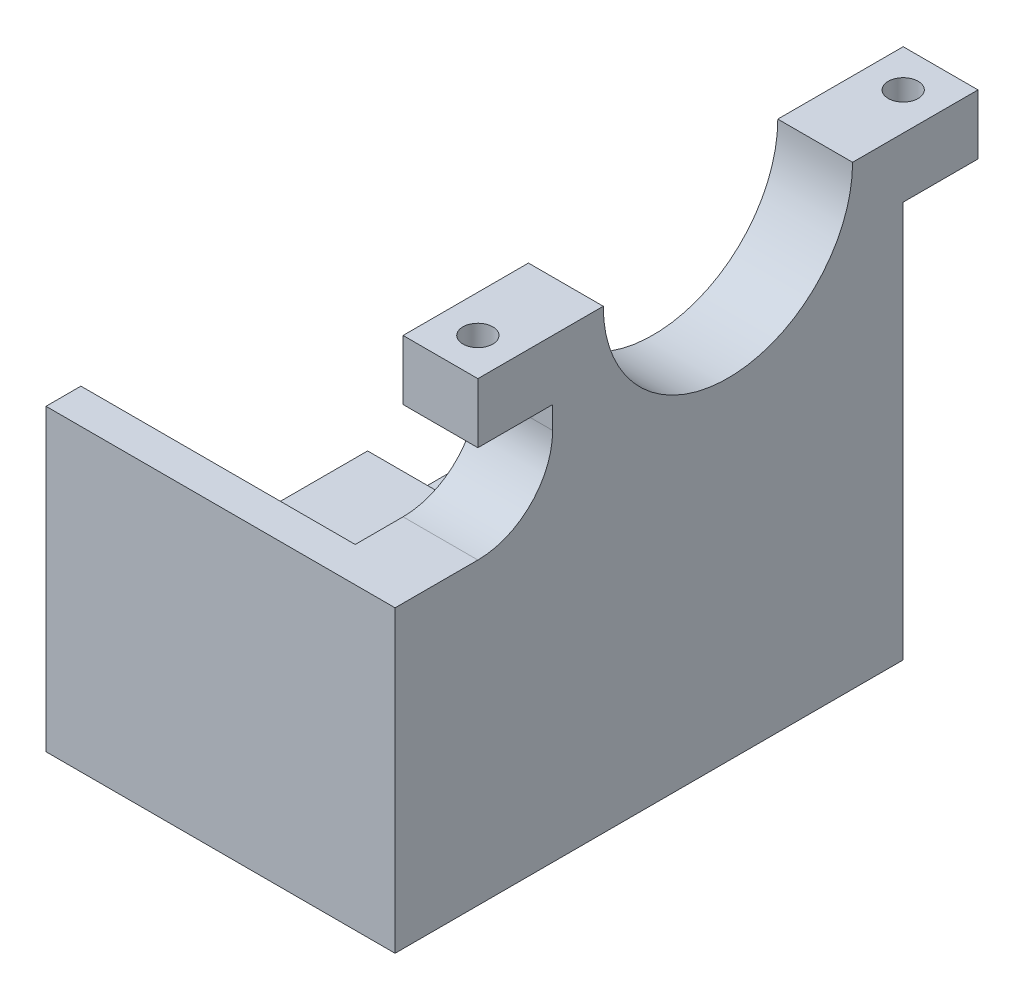
ISO-10303-21;
HEADER;
FILE_DESCRIPTION(('STEP AP214'),'2;1');
FILE_NAME('part.step','',(''),(''),'','','');
FILE_SCHEMA(('AUTOMOTIVE_DESIGN { 1 0 10303 214 1 1 1 1 }'));
ENDSEC;
DATA;
#1=APPLICATION_CONTEXT('core data for automotive mechanical design processes');
#2=APPLICATION_PROTOCOL_DEFINITION('international standard','automotive_design',2000,#1);
#3=PRODUCT_CONTEXT('',#1,'mechanical');
#4=PRODUCT('Part','Part','',(#3));
#5=PRODUCT_RELATED_PRODUCT_CATEGORY('part','',(#4));
#6=PRODUCT_DEFINITION_FORMATION('','',#4);
#7=PRODUCT_DEFINITION_CONTEXT('part definition',#1,'design');
#8=PRODUCT_DEFINITION('design','',#6,#7);
#9=PRODUCT_DEFINITION_SHAPE('','',#8);
#10=(LENGTH_UNIT() NAMED_UNIT(*) SI_UNIT(.MILLI.,.METRE.));
#11=(NAMED_UNIT(*) PLANE_ANGLE_UNIT() SI_UNIT($,.RADIAN.));
#12=(NAMED_UNIT(*) SI_UNIT($,.STERADIAN.) SOLID_ANGLE_UNIT());
#13=UNCERTAINTY_MEASURE_WITH_UNIT(LENGTH_MEASURE(1.E-05),#10,'distance_accuracy_value','');
#14=(GEOMETRIC_REPRESENTATION_CONTEXT(3) GLOBAL_UNCERTAINTY_ASSIGNED_CONTEXT((#13)) GLOBAL_UNIT_ASSIGNED_CONTEXT((#10,
#11,#12)) REPRESENTATION_CONTEXT('',''));
#15=CARTESIAN_POINT('',(0.,0.,0.));
#16=DIRECTION('',(0.,0.,1.));
#17=DIRECTION('',(1.,0.,0.));
#18=AXIS2_PLACEMENT_3D('',#15,#16,#17);
#19=CARTESIAN_POINT('',(-92.925,29.,0.));
#20=DIRECTION('',(0.,-1.,0.));
#21=DIRECTION('',(0.,0.,1.));
#22=AXIS2_PLACEMENT_3D('',#19,#20,#21);
#23=PLANE('',#22);
#24=DIRECTION('',(1.,0.,0.));
#25=VECTOR('',#24,1.);
#26=CARTESIAN_POINT('',(-92.925,29.,-80.1975398981366));
#27=LINE('',#26,#25);
#28=CARTESIAN_POINT('',(-92.925,29.,-80.1975398981366));
#29=VERTEX_POINT('',#28);
#30=CARTESIAN_POINT('',(-84.225,29.,-80.1975398981366));
#31=VERTEX_POINT('',#30);
#32=EDGE_CURVE('E324',#29,#31,#27,.T.);
#33=ORIENTED_EDGE('',*,*,#32,.F.);
#34=DIRECTION('',(0.,0.,1.));
#35=VECTOR('',#34,1.);
#36=CARTESIAN_POINT('',(-92.925,29.,0.));
#37=LINE('',#36,#35);
#38=CARTESIAN_POINT('',(-92.925,29.,-71.4975398981366));
#39=VERTEX_POINT('',#38);
#40=EDGE_CURVE('E319',#29,#39,#37,.T.);
#41=ORIENTED_EDGE('',*,*,#40,.T.);
#42=DIRECTION('',(1.,0.,0.));
#43=VECTOR('',#42,1.);
#44=CARTESIAN_POINT('',(0.,29.,-71.4975398981366));
#45=LINE('',#44,#43);
#46=CARTESIAN_POINT('',(-84.225,29.,-71.4975398981366));
#47=VERTEX_POINT('',#46);
#48=EDGE_CURVE('E464',#39,#47,#45,.T.);
#49=ORIENTED_EDGE('',*,*,#48,.T.);
#50=DIRECTION('',(0.,0.,-1.));
#51=VECTOR('',#50,1.);
#52=CARTESIAN_POINT('',(-84.225,29.,0.));
#53=LINE('',#52,#51);
#54=EDGE_CURVE('E447',#47,#31,#53,.T.);
#55=ORIENTED_EDGE('',*,*,#54,.T.);
#56=EDGE_LOOP('',(#33,#41,#49,#55));
#57=FACE_BOUND('',#56,.T.);
#58=ADVANCED_FACE('F37',(#57),#23,.F.);
#59=CARTESIAN_POINT('',(-65.425,-35.9364248901641,-80.1975398981366));
#60=DIRECTION('',(0.,0.,-1.));
#61=DIRECTION('',(1.,0.,0.));
#62=AXIS2_PLACEMENT_3D('',#59,#60,#61);
#63=PLANE('',#62);
#64=DIRECTION('',(0.,1.,0.));
#65=VECTOR('',#64,1.);
#66=CARTESIAN_POINT('',(-74.225,23.,-80.1975398981366));
#67=LINE('',#66,#65);
#68=CARTESIAN_POINT('',(-74.225,23.,-80.1975398981366));
#69=VERTEX_POINT('',#68);
#70=CARTESIAN_POINT('',(-74.225,29.,-80.1975398981366));
#71=VERTEX_POINT('',#70);
#72=EDGE_CURVE('E454',#69,#71,#67,.T.);
#73=ORIENTED_EDGE('',*,*,#72,.T.);
#74=CARTESIAN_POINT('',(-65.525,29.,-80.1975398981366));
#75=VERTEX_POINT('',#74);
#76=EDGE_CURVE('E328',#71,#75,#27,.T.);
#77=ORIENTED_EDGE('',*,*,#76,.T.);
#78=CARTESIAN_POINT('',(-65.525,29.1,-80.1975398981366));
#79=DIRECTION('',(0.,0.,1.));
#80=DIRECTION('',(1.,0.,0.));
#81=AXIS2_PLACEMENT_3D('',#78,#79,#80);
#82=CIRCLE('',#81,0.1);
#83=CARTESIAN_POINT('',(-65.425,29.1,-80.1975398981366));
#84=VERTEX_POINT('',#83);
#85=EDGE_CURVE('E359',#75,#84,#82,.T.);
#86=ORIENTED_EDGE('',*,*,#85,.T.);
#87=DIRECTION('',(0.,1.,0.));
#88=VECTOR('',#87,1.);
#89=CARTESIAN_POINT('',(-65.425,-35.9364248901641,-80.1975398981366));
#90=LINE('',#89,#88);
#91=CARTESIAN_POINT('',(-65.425,58.75,-80.1975398981366));
#92=VERTEX_POINT('',#91);
#93=EDGE_CURVE('E341',#84,#92,#90,.T.);
#94=ORIENTED_EDGE('',*,*,#93,.T.);
#95=DIRECTION('',(-1.,0.,0.));
#96=VECTOR('',#95,1.);
#97=CARTESIAN_POINT('',(0.,58.75,-80.1975398981366));
#98=LINE('',#97,#96);
#99=CARTESIAN_POINT('',(-57.925,58.75,-80.1975398981366));
#100=VERTEX_POINT('',#99);
#101=EDGE_CURVE('E238',#100,#92,#98,.T.);
#102=ORIENTED_EDGE('',*,*,#101,.F.);
#103=DIRECTION('',(0.,1.,0.));
#104=VECTOR('',#103,1.);
#105=CARTESIAN_POINT('',(-57.925,-35.9364248901641,-80.1975398981366));
#106=LINE('',#105,#104);
#107=CARTESIAN_POINT('',(-57.925,19.,-80.1975398981366));
#108=VERTEX_POINT('',#107);
#109=EDGE_CURVE('E337',#108,#100,#106,.T.);
#110=ORIENTED_EDGE('',*,*,#109,.F.);
#111=DIRECTION('',(1.,0.,0.));
#112=VECTOR('',#111,1.);
#113=CARTESIAN_POINT('',(-92.925,19.,-80.1975398981366));
#114=LINE('',#113,#112);
#115=CARTESIAN_POINT('',(-92.925,19.,-80.1975398981366));
#116=VERTEX_POINT('',#115);
#117=EDGE_CURVE('E322',#116,#108,#114,.T.);
#118=ORIENTED_EDGE('',*,*,#117,.F.);
#119=DIRECTION('',(0.,1.,0.));
#120=VECTOR('',#119,1.);
#121=CARTESIAN_POINT('',(-92.925,0.,-80.1975398981366));
#122=LINE('',#121,#120);
#123=EDGE_CURVE('E314',#116,#29,#122,.T.);
#124=ORIENTED_EDGE('',*,*,#123,.T.);
#125=ORIENTED_EDGE('',*,*,#32,.T.);
#126=DIRECTION('',(0.,1.,0.));
#127=VECTOR('',#126,1.);
#128=CARTESIAN_POINT('',(-84.225,23.,-80.1975398981366));
#129=LINE('',#128,#127);
#130=CARTESIAN_POINT('',(-84.225,23.,-80.1975398981366));
#131=VERTEX_POINT('',#130);
#132=EDGE_CURVE('E450',#131,#31,#129,.T.);
#133=ORIENTED_EDGE('',*,*,#132,.F.);
#134=DIRECTION('',(1.,0.,0.));
#135=VECTOR('',#134,1.);
#136=CARTESIAN_POINT('',(0.,23.,-80.1975398981366));
#137=LINE('',#136,#135);
#138=EDGE_CURVE('E226',#131,#69,#137,.T.);
#139=ORIENTED_EDGE('',*,*,#138,.T.);
#140=EDGE_LOOP('',(#73,#77,#86,#94,#102,#110,#118,#124,#125,#133,#139));
#141=FACE_BOUND('',#140,.T.);
#142=ADVANCED_FACE('F411',(#141),#63,.T.);
#143=CARTESIAN_POINT('',(-57.925,56.5,-37.5524601018634));
#144=DIRECTION('',(-1.,0.,0.));
#145=DIRECTION('',(0.,0.,-1.));
#146=AXIS2_PLACEMENT_3D('',#143,#144,#145);
#147=CYLINDRICAL_SURFACE('',#146,7.5);
#148=DIRECTION('',(1.,0.,0.));
#149=VECTOR('',#148,1.);
#150=CARTESIAN_POINT('',(-57.925,49.,-37.5524601018634));
#151=LINE('',#150,#149);
#152=CARTESIAN_POINT('',(-65.425,49.,-37.5524601018634));
#153=VERTEX_POINT('',#152);
#154=CARTESIAN_POINT('',(-57.925,49.,-37.5524601018634));
#155=VERTEX_POINT('',#154);
#156=EDGE_CURVE('E362',#153,#155,#151,.T.);
#157=ORIENTED_EDGE('',*,*,#156,.T.);
#158=CARTESIAN_POINT('',(-57.925,56.5,-37.5524601018634));
#159=DIRECTION('',(1.,0.,0.));
#160=DIRECTION('',(0.,0.,-1.));
#161=AXIS2_PLACEMENT_3D('',#158,#159,#160);
#162=CIRCLE('',#161,7.5);
#163=CARTESIAN_POINT('',(-57.925,56.5,-45.0524601018634));
#164=VERTEX_POINT('',#163);
#165=EDGE_CURVE('E11',#164,#155,#162,.F.);
#166=ORIENTED_EDGE('',*,*,#165,.F.);
#167=DIRECTION('',(1.,0.,0.));
#168=VECTOR('',#167,1.);
#169=CARTESIAN_POINT('',(-57.925,56.5,-45.0524601018634));
#170=LINE('',#169,#168);
#171=CARTESIAN_POINT('',(-65.425,56.5,-45.0524601018634));
#172=VERTEX_POINT('',#171);
#173=EDGE_CURVE('E365',#164,#172,#170,.F.);
#174=ORIENTED_EDGE('',*,*,#173,.T.);
#175=CARTESIAN_POINT('',(-65.425,56.5,-37.5524601018634));
#176=DIRECTION('',(1.,0.,0.));
#177=DIRECTION('',(0.,0.,-1.));
#178=AXIS2_PLACEMENT_3D('',#175,#176,#177);
#179=CIRCLE('',#178,7.5);
#180=EDGE_CURVE('E46',#153,#172,#179,.T.);
#181=ORIENTED_EDGE('',*,*,#180,.F.);
#182=EDGE_LOOP('',(#157,#166,#174,#181));
#183=FACE_BOUND('',#182,.T.);
#184=ADVANCED_FACE('F39',(#183),#147,.F.);
#185=CARTESIAN_POINT('',(-65.425,-35.9364248901641,-45.0524601018634));
#186=DIRECTION('',(0.,0.,-1.));
#187=DIRECTION('',(1.,0.,0.));
#188=AXIS2_PLACEMENT_3D('',#185,#186,#187);
#189=PLANE('',#188);
#190=DIRECTION('',(0.,1.,0.));
#191=VECTOR('',#190,1.);
#192=CARTESIAN_POINT('',(-57.925,-35.9364248901641,-45.0524601018634));
#193=LINE('',#192,#191);
#194=CARTESIAN_POINT('',(-57.925,58.75,-45.0524601018634));
#195=VERTEX_POINT('',#194);
#196=EDGE_CURVE('E336',#164,#195,#193,.T.);
#197=ORIENTED_EDGE('',*,*,#196,.T.);
#198=DIRECTION('',(-1.,0.,0.));
#199=VECTOR('',#198,1.);
#200=CARTESIAN_POINT('',(0.,58.75,-45.0524601018634));
#201=LINE('',#200,#199);
#202=CARTESIAN_POINT('',(-65.425,58.75,-45.0524601018634));
#203=VERTEX_POINT('',#202);
#204=EDGE_CURVE('E264',#195,#203,#201,.T.);
#205=ORIENTED_EDGE('',*,*,#204,.T.);
#206=DIRECTION('',(0.,1.,0.));
#207=VECTOR('',#206,1.);
#208=CARTESIAN_POINT('',(-65.425,-35.9364248901641,-45.0524601018634));
#209=LINE('',#208,#207);
#210=EDGE_CURVE('E344',#172,#203,#209,.T.);
#211=ORIENTED_EDGE('',*,*,#210,.F.);
#212=ORIENTED_EDGE('',*,*,#173,.F.);
#213=EDGE_LOOP('',(#197,#205,#211,#212));
#214=FACE_BOUND('',#213,.T.);
#215=ADVANCED_FACE('F379',(#214),#189,.F.);
#216=CARTESIAN_POINT('',(-70.425,64.75,-62.625));
#217=DIRECTION('',(1.,0.,0.));
#218=DIRECTION('',(0.,0.,1.));
#219=AXIS2_PLACEMENT_3D('',#216,#217,#218);
#220=CYLINDRICAL_SURFACE('',#219,12.5);
#221=DIRECTION('',(1.,0.,0.));
#222=VECTOR('',#221,1.);
#223=CARTESIAN_POINT('',(-70.425,64.75,-50.125));
#224=LINE('',#223,#222);
#225=CARTESIAN_POINT('',(-57.925,64.75,-50.125));
#226=VERTEX_POINT('',#225);
#227=CARTESIAN_POINT('',(-65.425,64.75,-50.125));
#228=VERTEX_POINT('',#227);
#229=EDGE_CURVE('E351',#226,#228,#224,.F.);
#230=ORIENTED_EDGE('',*,*,#229,.F.);
#231=CARTESIAN_POINT('',(-57.925,64.75,-62.625));
#232=DIRECTION('',(1.,0.,0.));
#233=DIRECTION('',(0.,0.,-1.));
#234=AXIS2_PLACEMENT_3D('',#231,#232,#233);
#235=CIRCLE('',#234,12.5);
#236=CARTESIAN_POINT('',(-57.925,64.75,-75.125));
#237=VERTEX_POINT('',#236);
#238=EDGE_CURVE('E327',#226,#237,#235,.T.);
#239=ORIENTED_EDGE('',*,*,#238,.T.);
#240=DIRECTION('',(1.,0.,0.));
#241=VECTOR('',#240,1.);
#242=CARTESIAN_POINT('',(-70.425,64.75,-75.125));
#243=LINE('',#242,#241);
#244=CARTESIAN_POINT('',(-65.425,64.75,-75.125));
#245=VERTEX_POINT('',#244);
#246=EDGE_CURVE('E340',#245,#237,#243,.T.);
#247=ORIENTED_EDGE('',*,*,#246,.F.);
#248=CARTESIAN_POINT('',(-65.425,64.75,-62.625));
#249=DIRECTION('',(1.,0.,0.));
#250=DIRECTION('',(0.,0.,-1.));
#251=AXIS2_PLACEMENT_3D('',#248,#249,#250);
#252=CIRCLE('',#251,12.5);
#253=EDGE_CURVE('E333',#245,#228,#252,.F.);
#254=ORIENTED_EDGE('',*,*,#253,.T.);
#255=EDGE_LOOP('',(#230,#239,#247,#254));
#256=FACE_BOUND('',#255,.T.);
#257=ADVANCED_FACE('F395',(#256),#220,.F.);
#258=CARTESIAN_POINT('',(0.,64.75,0.));
#259=DIRECTION('',(0.,-1.,0.));
#260=DIRECTION('',(0.,0.,-1.));
#261=AXIS2_PLACEMENT_3D('',#258,#259,#260);
#262=PLANE('',#261);
#263=DIRECTION('',(0.,0.,-1.));
#264=VECTOR('',#263,1.);
#265=CARTESIAN_POINT('',(-57.925,64.75,-72.625));
#266=LINE('',#265,#264);
#267=CARTESIAN_POINT('',(-57.925,64.75,-87.6975398981366));
#268=VERTEX_POINT('',#267);
#269=EDGE_CURVE('E276',#237,#268,#266,.T.);
#270=ORIENTED_EDGE('',*,*,#269,.T.);
#271=DIRECTION('',(-1.,0.,0.));
#272=VECTOR('',#271,1.);
#273=CARTESIAN_POINT('',(0.,64.75,-87.6975398981366));
#274=LINE('',#273,#272);
#275=CARTESIAN_POINT('',(-65.425,64.75,-87.6975398981366));
#276=VERTEX_POINT('',#275);
#277=EDGE_CURVE('E235',#268,#276,#274,.T.);
#278=ORIENTED_EDGE('',*,*,#277,.T.);
#279=DIRECTION('',(0.,0.,1.));
#280=VECTOR('',#279,1.);
#281=CARTESIAN_POINT('',(-65.425,64.75,-72.625));
#282=LINE('',#281,#280);
#283=EDGE_CURVE('E274',#276,#245,#282,.T.);
#284=ORIENTED_EDGE('',*,*,#283,.T.);
#285=ORIENTED_EDGE('',*,*,#246,.T.);
#286=EDGE_LOOP('',(#270,#278,#284,#285));
#287=FACE_BOUND('',#286,.T.);
#288=CARTESIAN_POINT('',(-61.675,64.75,-83.9475398981366));
#289=DIRECTION('',(0.,1.,0.));
#290=DIRECTION('',(0.,0.,1.));
#291=AXIS2_PLACEMENT_3D('',#288,#289,#290);
#292=CIRCLE('',#291,1.5);
#293=CARTESIAN_POINT('',(-61.675,64.75,-82.4475398981366));
#294=VERTEX_POINT('',#293);
#295=EDGE_CURVE('E244',#294,#294,#292,.T.);
#296=ORIENTED_EDGE('',*,*,#295,.F.);
#297=EDGE_LOOP('',(#296));
#298=FACE_BOUND('',#297,.T.);
#299=ADVANCED_FACE('F400',(#287,#298),#262,.F.);
#300=CARTESIAN_POINT('',(-65.425,-35.9364248901641,-45.0524601018634));
#301=DIRECTION('',(-1.,0.,0.));
#302=DIRECTION('',(0.,0.,-1.));
#303=AXIS2_PLACEMENT_3D('',#300,#301,#302);
#304=PLANE('',#303);
#305=ORIENTED_EDGE('',*,*,#253,.F.);
#306=ORIENTED_EDGE('',*,*,#283,.F.);
#307=DIRECTION('',(0.,1.,0.));
#308=VECTOR('',#307,1.);
#309=CARTESIAN_POINT('',(-65.425,58.75,-87.6975398981366));
#310=LINE('',#309,#308);
#311=CARTESIAN_POINT('',(-65.425,58.75,-87.6975398981366));
#312=VERTEX_POINT('',#311);
#313=EDGE_CURVE('E243',#312,#276,#310,.T.);
#314=ORIENTED_EDGE('',*,*,#313,.F.);
#315=DIRECTION('',(0.,0.,1.));
#316=VECTOR('',#315,1.);
#317=CARTESIAN_POINT('',(-65.425,58.75,-125.25));
#318=LINE('',#317,#316);
#319=EDGE_CURVE('E61',#312,#92,#318,.T.);
#320=ORIENTED_EDGE('',*,*,#319,.T.);
#321=ORIENTED_EDGE('',*,*,#93,.F.);
#322=DIRECTION('',(0.,0.,1.));
#323=VECTOR('',#322,1.);
#324=CARTESIAN_POINT('',(-65.425,29.1,-45.0524601018634));
#325=LINE('',#324,#323);
#326=CARTESIAN_POINT('',(-65.425,29.1,-32.7524601018634));
#327=VERTEX_POINT('',#326);
#328=EDGE_CURVE('E357',#327,#84,#325,.F.);
#329=ORIENTED_EDGE('',*,*,#328,.F.);
#330=DIRECTION('',(0.,1.,0.));
#331=VECTOR('',#330,1.);
#332=CARTESIAN_POINT('',(-65.425,49.,-32.7524601018634));
#333=LINE('',#332,#331);
#334=CARTESIAN_POINT('',(-65.425,49.,-32.7524601018634));
#335=VERTEX_POINT('',#334);
#336=EDGE_CURVE('E306',#327,#335,#333,.T.);
#337=ORIENTED_EDGE('',*,*,#336,.T.);
#338=DIRECTION('',(0.,0.,-1.));
#339=VECTOR('',#338,1.);
#340=CARTESIAN_POINT('',(-65.425,49.,-32.7524601018634));
#341=LINE('',#340,#339);
#342=EDGE_CURVE('E311',#335,#153,#341,.T.);
#343=ORIENTED_EDGE('',*,*,#342,.T.);
#344=ORIENTED_EDGE('',*,*,#180,.T.);
#345=ORIENTED_EDGE('',*,*,#210,.T.);
#346=DIRECTION('',(0.,0.,-1.));
#347=VECTOR('',#346,1.);
#348=CARTESIAN_POINT('',(-65.425,58.75,0.));
#349=LINE('',#348,#347);
#350=CARTESIAN_POINT('',(-65.425,58.75,-37.5524601018634));
#351=VERTEX_POINT('',#350);
#352=EDGE_CURVE('E262',#351,#203,#349,.T.);
#353=ORIENTED_EDGE('',*,*,#352,.F.);
#354=DIRECTION('',(0.,1.,0.));
#355=VECTOR('',#354,1.);
#356=CARTESIAN_POINT('',(-65.425,58.75,-37.5524601018634));
#357=LINE('',#356,#355);
#358=CARTESIAN_POINT('',(-65.425,64.75,-37.5524601018634));
#359=VERTEX_POINT('',#358);
#360=EDGE_CURVE('E271',#351,#359,#357,.T.);
#361=ORIENTED_EDGE('',*,*,#360,.T.);
#362=DIRECTION('',(0.,0.,-1.));
#363=VECTOR('',#362,1.);
#364=CARTESIAN_POINT('',(-65.425,64.75,-52.625));
#365=LINE('',#364,#363);
#366=EDGE_CURVE('E279',#359,#228,#365,.T.);
#367=ORIENTED_EDGE('',*,*,#366,.T.);
#368=EDGE_LOOP('',(#305,#306,#314,#320,#321,#329,#337,#343,#344,#345,#353,#361,#367));
#369=FACE_BOUND('',#368,.T.);
#370=ADVANCED_FACE('F371',(#369),#304,.T.);
#371=CARTESIAN_POINT('',(-65.525,29.1,0.));
#372=DIRECTION('',(0.,0.,1.));
#373=DIRECTION('',(-1.,0.,0.));
#374=AXIS2_PLACEMENT_3D('',#371,#372,#373);
#375=CYLINDRICAL_SURFACE('',#374,0.1);
#376=DIRECTION('',(0.,0.,1.));
#377=VECTOR('',#376,1.);
#378=CARTESIAN_POINT('',(-65.525,29.,0.));
#379=LINE('',#378,#377);
#380=CARTESIAN_POINT('',(-65.525,29.,-32.7524601018634));
#381=VERTEX_POINT('',#380);
#382=EDGE_CURVE('E354',#75,#381,#379,.T.);
#383=ORIENTED_EDGE('',*,*,#382,.T.);
#384=CARTESIAN_POINT('',(-65.525,29.1,-32.7524601018634));
#385=DIRECTION('',(0.,0.,1.));
#386=DIRECTION('',(1.,0.,0.));
#387=AXIS2_PLACEMENT_3D('',#384,#385,#386);
#388=CIRCLE('',#387,0.100000000000001);
#389=EDGE_CURVE('E304',#381,#327,#388,.T.);
#390=ORIENTED_EDGE('',*,*,#389,.T.);
#391=ORIENTED_EDGE('',*,*,#328,.T.);
#392=ORIENTED_EDGE('',*,*,#85,.F.);
#393=EDGE_LOOP('',(#383,#390,#391,#392));
#394=FACE_BOUND('',#393,.T.);
#395=ADVANCED_FACE('F417',(#394),#375,.F.);
#396=ORIENTED_EDGE('',*,*,#229,.T.);
#397=ORIENTED_EDGE('',*,*,#366,.F.);
#398=DIRECTION('',(-1.,0.,0.));
#399=VECTOR('',#398,1.);
#400=CARTESIAN_POINT('',(0.,64.75,-37.5524601018634));
#401=LINE('',#400,#399);
#402=CARTESIAN_POINT('',(-57.925,64.75,-37.5524601018634));
#403=VERTEX_POINT('',#402);
#404=EDGE_CURVE('E257',#403,#359,#401,.T.);
#405=ORIENTED_EDGE('',*,*,#404,.F.);
#406=DIRECTION('',(0.,0.,1.));
#407=VECTOR('',#406,1.);
#408=CARTESIAN_POINT('',(-57.925,64.75,-52.625));
#409=LINE('',#408,#407);
#410=EDGE_CURVE('E281',#226,#403,#409,.T.);
#411=ORIENTED_EDGE('',*,*,#410,.F.);
#412=EDGE_LOOP('',(#396,#397,#405,#411));
#413=FACE_BOUND('',#412,.T.);
#414=CARTESIAN_POINT('',(-61.675,64.75,-41.3024601018634));
#415=DIRECTION('',(0.,-1.,0.));
#416=DIRECTION('',(0.,0.,-1.));
#417=AXIS2_PLACEMENT_3D('',#414,#415,#416);
#418=CIRCLE('',#417,1.5);
#419=CARTESIAN_POINT('',(-61.675,64.75,-42.8024601018634));
#420=VERTEX_POINT('',#419);
#421=EDGE_CURVE('E251',#420,#420,#418,.T.);
#422=ORIENTED_EDGE('',*,*,#421,.T.);
#423=EDGE_LOOP('',(#422));
#424=FACE_BOUND('',#423,.T.);
#425=ADVANCED_FACE('F390',(#413,#424),#262,.F.);
#426=CARTESIAN_POINT('',(-57.925,-35.9364248901641,-45.0524601018634));
#427=DIRECTION('',(-1.,0.,0.));
#428=DIRECTION('',(0.,0.,-1.));
#429=AXIS2_PLACEMENT_3D('',#426,#427,#428);
#430=PLANE('',#429);
#431=ORIENTED_EDGE('',*,*,#165,.T.);
#432=DIRECTION('',(0.,0.,-1.));
#433=VECTOR('',#432,1.);
#434=CARTESIAN_POINT('',(-57.925,49.,-32.7524601018634));
#435=LINE('',#434,#433);
#436=CARTESIAN_POINT('',(-57.925,49.,-29.2524601018634));
#437=VERTEX_POINT('',#436);
#438=EDGE_CURVE('E309',#437,#155,#435,.T.);
#439=ORIENTED_EDGE('',*,*,#438,.F.);
#440=DIRECTION('',(0.,-1.,0.));
#441=VECTOR('',#440,1.);
#442=CARTESIAN_POINT('',(-57.925,49.,-29.2524601018634));
#443=LINE('',#442,#441);
#444=CARTESIAN_POINT('',(-57.925,19.,-29.2524601018634));
#445=VERTEX_POINT('',#444);
#446=EDGE_CURVE('E293',#437,#445,#443,.T.);
#447=ORIENTED_EDGE('',*,*,#446,.T.);
#448=DIRECTION('',(0.,0.,-1.));
#449=VECTOR('',#448,1.);
#450=CARTESIAN_POINT('',(-57.925,19.,0.));
#451=LINE('',#450,#449);
#452=EDGE_CURVE('E313',#445,#108,#451,.T.);
#453=ORIENTED_EDGE('',*,*,#452,.T.);
#454=ORIENTED_EDGE('',*,*,#109,.T.);
#455=DIRECTION('',(0.,0.,-1.));
#456=VECTOR('',#455,1.);
#457=CARTESIAN_POINT('',(-57.925,58.75,-125.25));
#458=LINE('',#457,#456);
#459=CARTESIAN_POINT('',(-57.925,58.75,-87.6975398981366));
#460=VERTEX_POINT('',#459);
#461=EDGE_CURVE('E234',#100,#460,#458,.T.);
#462=ORIENTED_EDGE('',*,*,#461,.T.);
#463=DIRECTION('',(0.,1.,0.));
#464=VECTOR('',#463,1.);
#465=CARTESIAN_POINT('',(-57.925,58.75,-87.6975398981366));
#466=LINE('',#465,#464);
#467=EDGE_CURVE('E249',#460,#268,#466,.T.);
#468=ORIENTED_EDGE('',*,*,#467,.T.);
#469=ORIENTED_EDGE('',*,*,#269,.F.);
#470=ORIENTED_EDGE('',*,*,#238,.F.);
#471=ORIENTED_EDGE('',*,*,#410,.T.);
#472=DIRECTION('',(0.,1.,0.));
#473=VECTOR('',#472,1.);
#474=CARTESIAN_POINT('',(-57.925,58.75,-37.5524601018634));
#475=LINE('',#474,#473);
#476=CARTESIAN_POINT('',(-57.925,58.75,-37.5524601018634));
#477=VERTEX_POINT('',#476);
#478=EDGE_CURVE('E267',#477,#403,#475,.T.);
#479=ORIENTED_EDGE('',*,*,#478,.F.);
#480=DIRECTION('',(0.,0.,1.));
#481=VECTOR('',#480,1.);
#482=CARTESIAN_POINT('',(-57.925,58.75,0.));
#483=LINE('',#482,#481);
#484=EDGE_CURVE('E256',#195,#477,#483,.T.);
#485=ORIENTED_EDGE('',*,*,#484,.F.);
#486=ORIENTED_EDGE('',*,*,#196,.F.);
#487=EDGE_LOOP('',(#431,#439,#447,#453,#454,#462,#468,#469,#470,#471,#479,#485,#486));
#488=FACE_BOUND('',#487,.T.);
#489=ADVANCED_FACE('F429',(#488),#430,.F.);
#490=CARTESIAN_POINT('',(-79.225,29.,-66.4975398981366));
#491=DIRECTION('',(0.,-1.,0.));
#492=DIRECTION('',(0.,0.,-1.));
#493=AXIS2_PLACEMENT_3D('',#490,#491,#492);
#494=CIRCLE('',#493,5.00000000000001);
#495=CARTESIAN_POINT('',(-74.225,29.,-66.4975398981366));
#496=VERTEX_POINT('',#495);
#497=CARTESIAN_POINT('',(-79.225,29.,-61.4975398981366));
#498=VERTEX_POINT('',#497);
#499=EDGE_CURVE('E210',#496,#498,#494,.T.);
#500=ORIENTED_EDGE('',*,*,#499,.T.);
#501=DIRECTION('',(-1.,0.,0.));
#502=VECTOR('',#501,1.);
#503=CARTESIAN_POINT('',(0.,29.,-61.4975398981366));
#504=LINE('',#503,#502);
#505=CARTESIAN_POINT('',(-92.925,29.,-61.4975398981366));
#506=VERTEX_POINT('',#505);
#507=EDGE_CURVE('E209',#498,#506,#504,.T.);
#508=ORIENTED_EDGE('',*,*,#507,.T.);
#509=CARTESIAN_POINT('',(-92.925,29.,-32.7524601018634));
#510=VERTEX_POINT('',#509);
#511=EDGE_CURVE('E318',#506,#510,#37,.T.);
#512=ORIENTED_EDGE('',*,*,#511,.T.);
#513=DIRECTION('',(1.,0.,0.));
#514=VECTOR('',#513,1.);
#515=CARTESIAN_POINT('',(-92.925,29.,-32.7524601018634));
#516=LINE('',#515,#514);
#517=EDGE_CURVE('E298',#510,#381,#516,.T.);
#518=ORIENTED_EDGE('',*,*,#517,.T.);
#519=ORIENTED_EDGE('',*,*,#382,.F.);
#520=ORIENTED_EDGE('',*,*,#76,.F.);
#521=DIRECTION('',(0.,0.,1.));
#522=VECTOR('',#521,1.);
#523=CARTESIAN_POINT('',(-74.225,29.,0.));
#524=LINE('',#523,#522);
#525=EDGE_CURVE('E216',#71,#496,#524,.T.);
#526=ORIENTED_EDGE('',*,*,#525,.T.);
#527=EDGE_LOOP('',(#500,#508,#512,#518,#519,#520,#526));
#528=FACE_BOUND('',#527,.T.);
#529=ADVANCED_FACE('F491',(#528),#23,.F.);
#530=CARTESIAN_POINT('',(-92.925,19.,0.));
#531=DIRECTION('',(0.,1.,0.));
#532=DIRECTION('',(0.,0.,-1.));
#533=AXIS2_PLACEMENT_3D('',#530,#531,#532);
#534=PLANE('',#533);
#535=CARTESIAN_POINT('',(-79.225,19.,-66.4975398981366));
#536=DIRECTION('',(0.,-1.,0.));
#537=DIRECTION('',(0.,0.,-1.));
#538=AXIS2_PLACEMENT_3D('',#535,#536,#537);
#539=CIRCLE('',#538,1.5);
#540=CARTESIAN_POINT('',(-79.225,19.,-67.9975398981366));
#541=VERTEX_POINT('',#540);
#542=EDGE_CURVE('E473',#541,#541,#539,.T.);
#543=ORIENTED_EDGE('',*,*,#542,.F.);
#544=EDGE_LOOP('',(#543));
#545=FACE_BOUND('',#544,.T.);
#546=ORIENTED_EDGE('',*,*,#452,.F.);
#547=DIRECTION('',(-1.,0.,0.));
#548=VECTOR('',#547,1.);
#549=CARTESIAN_POINT('',(0.,19.,-29.2524601018634));
#550=LINE('',#549,#548);
#551=CARTESIAN_POINT('',(-92.925,19.,-29.2524601018634));
#552=VERTEX_POINT('',#551);
#553=EDGE_CURVE('E284',#445,#552,#550,.T.);
#554=ORIENTED_EDGE('',*,*,#553,.T.);
#555=DIRECTION('',(0.,0.,-1.));
#556=VECTOR('',#555,1.);
#557=CARTESIAN_POINT('',(-92.925,19.,0.));
#558=LINE('',#557,#556);
#559=EDGE_CURVE('E316',#552,#116,#558,.T.);
#560=ORIENTED_EDGE('',*,*,#559,.T.);
#561=ORIENTED_EDGE('',*,*,#117,.T.);
#562=EDGE_LOOP('',(#546,#554,#560,#561));
#563=FACE_BOUND('',#562,.T.);
#564=ADVANCED_FACE('F435',(#545,#563),#534,.F.);
#565=CARTESIAN_POINT('',(-92.925,0.,0.));
#566=DIRECTION('',(1.,0.,0.));
#567=DIRECTION('',(0.,0.,1.));
#568=AXIS2_PLACEMENT_3D('',#565,#566,#567);
#569=PLANE('',#568);
#570=ORIENTED_EDGE('',*,*,#40,.F.);
#571=ORIENTED_EDGE('',*,*,#123,.F.);
#572=ORIENTED_EDGE('',*,*,#559,.F.);
#573=DIRECTION('',(0.,-1.,0.));
#574=VECTOR('',#573,1.);
#575=CARTESIAN_POINT('',(-92.925,49.,-29.2524601018634));
#576=LINE('',#575,#574);
#577=CARTESIAN_POINT('',(-92.925,49.,-29.2524601018634));
#578=VERTEX_POINT('',#577);
#579=EDGE_CURVE('E296',#578,#552,#576,.T.);
#580=ORIENTED_EDGE('',*,*,#579,.F.);
#581=DIRECTION('',(0.,0.,1.));
#582=VECTOR('',#581,1.);
#583=CARTESIAN_POINT('',(-92.925,49.,0.));
#584=LINE('',#583,#582);
#585=CARTESIAN_POINT('',(-92.925,49.,-32.7524601018634));
#586=VERTEX_POINT('',#585);
#587=EDGE_CURVE('E290',#586,#578,#584,.T.);
#588=ORIENTED_EDGE('',*,*,#587,.F.);
#589=DIRECTION('',(0.,-1.,0.));
#590=VECTOR('',#589,1.);
#591=CARTESIAN_POINT('',(-92.925,49.,-32.7524601018634));
#592=LINE('',#591,#590);
#593=EDGE_CURVE('E299',#586,#510,#592,.T.);
#594=ORIENTED_EDGE('',*,*,#593,.T.);
#595=ORIENTED_EDGE('',*,*,#511,.F.);
#596=DIRECTION('',(0.,1.,0.));
#597=VECTOR('',#596,1.);
#598=CARTESIAN_POINT('',(-92.925,23.,-61.4975398981366));
#599=LINE('',#598,#597);
#600=CARTESIAN_POINT('',(-92.925,23.,-61.4975398981366));
#601=VERTEX_POINT('',#600);
#602=EDGE_CURVE('E221',#601,#506,#599,.T.);
#603=ORIENTED_EDGE('',*,*,#602,.F.);
#604=DIRECTION('',(0.,0.,-1.));
#605=VECTOR('',#604,1.);
#606=CARTESIAN_POINT('',(-92.925,23.,0.));
#607=LINE('',#606,#605);
#608=CARTESIAN_POINT('',(-92.925,23.,-71.4975398981366));
#609=VERTEX_POINT('',#608);
#610=EDGE_CURVE('E214',#601,#609,#607,.T.);
#611=ORIENTED_EDGE('',*,*,#610,.T.);
#612=DIRECTION('',(0.,1.,0.));
#613=VECTOR('',#612,1.);
#614=CARTESIAN_POINT('',(-92.925,23.,-71.4975398981366));
#615=LINE('',#614,#613);
#616=EDGE_CURVE('E224',#609,#39,#615,.T.);
#617=ORIENTED_EDGE('',*,*,#616,.T.);
#618=EDGE_LOOP('',(#570,#571,#572,#580,#588,#594,#595,#603,#611,#617));
#619=FACE_BOUND('',#618,.T.);
#620=ADVANCED_FACE('F439',(#619),#569,.F.);
#621=CARTESIAN_POINT('',(-57.925,49.,-32.7524601018634));
#622=DIRECTION('',(0.,-1.,0.));
#623=DIRECTION('',(0.,0.,1.));
#624=AXIS2_PLACEMENT_3D('',#621,#622,#623);
#625=PLANE('',#624);
#626=ORIENTED_EDGE('',*,*,#342,.F.);
#627=DIRECTION('',(1.,0.,0.));
#628=VECTOR('',#627,1.);
#629=CARTESIAN_POINT('',(0.,49.,-32.7524601018634));
#630=LINE('',#629,#628);
#631=EDGE_CURVE('E288',#586,#335,#630,.T.);
#632=ORIENTED_EDGE('',*,*,#631,.F.);
#633=ORIENTED_EDGE('',*,*,#587,.T.);
#634=DIRECTION('',(-1.,0.,0.));
#635=VECTOR('',#634,1.);
#636=CARTESIAN_POINT('',(0.,49.,-29.2524601018634));
#637=LINE('',#636,#635);
#638=EDGE_CURVE('E286',#437,#578,#637,.T.);
#639=ORIENTED_EDGE('',*,*,#638,.F.);
#640=ORIENTED_EDGE('',*,*,#438,.T.);
#641=ORIENTED_EDGE('',*,*,#156,.F.);
#642=EDGE_LOOP('',(#626,#632,#633,#639,#640,#641));
#643=FACE_BOUND('',#642,.T.);
#644=ADVANCED_FACE('F425',(#643),#625,.F.);
#645=CARTESIAN_POINT('',(0.,49.,-32.7524601018634));
#646=DIRECTION('',(0.,0.,1.));
#647=DIRECTION('',(-1.,0.,0.));
#648=AXIS2_PLACEMENT_3D('',#645,#646,#647);
#649=PLANE('',#648);
#650=ORIENTED_EDGE('',*,*,#593,.F.);
#651=ORIENTED_EDGE('',*,*,#631,.T.);
#652=ORIENTED_EDGE('',*,*,#336,.F.);
#653=ORIENTED_EDGE('',*,*,#389,.F.);
#654=ORIENTED_EDGE('',*,*,#517,.F.);
#655=EDGE_LOOP('',(#650,#651,#652,#653,#654));
#656=FACE_BOUND('',#655,.T.);
#657=ADVANCED_FACE('F422',(#656),#649,.F.);
#658=CARTESIAN_POINT('',(0.,49.,-29.2524601018634));
#659=DIRECTION('',(0.,0.,-1.));
#660=DIRECTION('',(1.,0.,0.));
#661=AXIS2_PLACEMENT_3D('',#658,#659,#660);
#662=PLANE('',#661);
#663=ORIENTED_EDGE('',*,*,#553,.F.);
#664=ORIENTED_EDGE('',*,*,#446,.F.);
#665=ORIENTED_EDGE('',*,*,#638,.T.);
#666=ORIENTED_EDGE('',*,*,#579,.T.);
#667=EDGE_LOOP('',(#663,#664,#665,#666));
#668=FACE_BOUND('',#667,.T.);
#669=ADVANCED_FACE('F517',(#668),#662,.F.);
#670=CARTESIAN_POINT('',(-61.675,58.75,-41.3024601018634));
#671=DIRECTION('',(0.,1.,0.));
#672=DIRECTION('',(0.,0.,-1.));
#673=AXIS2_PLACEMENT_3D('',#670,#671,#672);
#674=CYLINDRICAL_SURFACE('',#673,1.5);
#675=CARTESIAN_POINT('',(-61.675,58.75,-41.3024601018634));
#676=DIRECTION('',(0.,-1.,0.));
#677=DIRECTION('',(0.,0.,-1.));
#678=AXIS2_PLACEMENT_3D('',#675,#676,#677);
#679=CIRCLE('',#678,1.5);
#680=CARTESIAN_POINT('',(-61.675,58.75,-42.8024601018634));
#681=VERTEX_POINT('',#680);
#682=EDGE_CURVE('E253',#681,#681,#679,.T.);
#683=ORIENTED_EDGE('',*,*,#682,.T.);
#684=EDGE_LOOP('',(#683));
#685=FACE_BOUND('',#684,.T.);
#686=ORIENTED_EDGE('',*,*,#421,.F.);
#687=EDGE_LOOP('',(#686));
#688=FACE_BOUND('',#687,.T.);
#689=ADVANCED_FACE('F519',(#685,#688),#674,.F.);
#690=CARTESIAN_POINT('',(0.,58.75,-37.5524601018634));
#691=DIRECTION('',(0.,0.,1.));
#692=DIRECTION('',(-1.,0.,0.));
#693=AXIS2_PLACEMENT_3D('',#690,#691,#692);
#694=PLANE('',#693);
#695=ORIENTED_EDGE('',*,*,#404,.T.);
#696=ORIENTED_EDGE('',*,*,#360,.F.);
#697=DIRECTION('',(-1.,0.,0.));
#698=VECTOR('',#697,1.);
#699=CARTESIAN_POINT('',(0.,58.75,-37.5524601018634));
#700=LINE('',#699,#698);
#701=EDGE_CURVE('E260',#477,#351,#700,.T.);
#702=ORIENTED_EDGE('',*,*,#701,.F.);
#703=ORIENTED_EDGE('',*,*,#478,.T.);
#704=EDGE_LOOP('',(#695,#696,#702,#703));
#705=FACE_BOUND('',#704,.T.);
#706=ADVANCED_FACE('F387',(#705),#694,.T.);
#707=CARTESIAN_POINT('',(0.,58.75,0.));
#708=DIRECTION('',(0.,1.,0.));
#709=DIRECTION('',(0.,0.,-1.));
#710=AXIS2_PLACEMENT_3D('',#707,#708,#709);
#711=PLANE('',#710);
#712=ORIENTED_EDGE('',*,*,#682,.F.);
#713=EDGE_LOOP('',(#712));
#714=FACE_BOUND('',#713,.T.);
#715=ORIENTED_EDGE('',*,*,#484,.T.);
#716=ORIENTED_EDGE('',*,*,#701,.T.);
#717=ORIENTED_EDGE('',*,*,#352,.T.);
#718=ORIENTED_EDGE('',*,*,#204,.F.);
#719=EDGE_LOOP('',(#715,#716,#717,#718));
#720=FACE_BOUND('',#719,.T.);
#721=ADVANCED_FACE('F382',(#714,#720),#711,.F.);
#722=CARTESIAN_POINT('',(0.,58.75,-87.6975398981366));
#723=DIRECTION('',(0.,0.,1.));
#724=DIRECTION('',(-1.,0.,0.));
#725=AXIS2_PLACEMENT_3D('',#722,#723,#724);
#726=PLANE('',#725);
#727=ORIENTED_EDGE('',*,*,#277,.F.);
#728=ORIENTED_EDGE('',*,*,#467,.F.);
#729=DIRECTION('',(-1.,0.,0.));
#730=VECTOR('',#729,1.);
#731=CARTESIAN_POINT('',(0.,58.75,-87.6975398981366));
#732=LINE('',#731,#730);
#733=EDGE_CURVE('E241',#460,#312,#732,.T.);
#734=ORIENTED_EDGE('',*,*,#733,.T.);
#735=ORIENTED_EDGE('',*,*,#313,.T.);
#736=EDGE_LOOP('',(#727,#728,#734,#735));
#737=FACE_BOUND('',#736,.T.);
#738=ADVANCED_FACE('F404',(#737),#726,.F.);
#739=CARTESIAN_POINT('',(-61.675,58.75,-83.9475398981366));
#740=DIRECTION('',(0.,1.,0.));
#741=DIRECTION('',(0.,0.,-1.));
#742=AXIS2_PLACEMENT_3D('',#739,#740,#741);
#743=CYLINDRICAL_SURFACE('',#742,1.5);
#744=CARTESIAN_POINT('',(-61.675,58.75,-83.9475398981366));
#745=DIRECTION('',(0.,1.,0.));
#746=DIRECTION('',(0.,0.,1.));
#747=AXIS2_PLACEMENT_3D('',#744,#745,#746);
#748=CIRCLE('',#747,1.5);
#749=CARTESIAN_POINT('',(-61.675,58.75,-82.4475398981366));
#750=VERTEX_POINT('',#749);
#751=EDGE_CURVE('E231',#750,#750,#748,.T.);
#752=ORIENTED_EDGE('',*,*,#751,.F.);
#753=EDGE_LOOP('',(#752));
#754=FACE_BOUND('',#753,.T.);
#755=ORIENTED_EDGE('',*,*,#295,.T.);
#756=EDGE_LOOP('',(#755));
#757=FACE_BOUND('',#756,.T.);
#758=ADVANCED_FACE('F581',(#754,#757),#743,.F.);
#759=CARTESIAN_POINT('',(0.,58.75,-125.25));
#760=DIRECTION('',(0.,1.,0.));
#761=DIRECTION('',(0.,0.,1.));
#762=AXIS2_PLACEMENT_3D('',#759,#760,#761);
#763=PLANE('',#762);
#764=ORIENTED_EDGE('',*,*,#751,.T.);
#765=EDGE_LOOP('',(#764));
#766=FACE_BOUND('',#765,.T.);
#767=ORIENTED_EDGE('',*,*,#461,.F.);
#768=ORIENTED_EDGE('',*,*,#101,.T.);
#769=ORIENTED_EDGE('',*,*,#319,.F.);
#770=ORIENTED_EDGE('',*,*,#733,.F.);
#771=EDGE_LOOP('',(#767,#768,#769,#770));
#772=FACE_BOUND('',#771,.T.);
#773=ADVANCED_FACE('F406',(#766,#772),#763,.F.);
#774=CARTESIAN_POINT('',(-74.225,23.,0.));
#775=DIRECTION('',(1.,0.,0.));
#776=DIRECTION('',(0.,0.,1.));
#777=AXIS2_PLACEMENT_3D('',#774,#775,#776);
#778=PLANE('',#777);
#779=ORIENTED_EDGE('',*,*,#525,.F.);
#780=ORIENTED_EDGE('',*,*,#72,.F.);
#781=DIRECTION('',(0.,0.,1.));
#782=VECTOR('',#781,1.);
#783=CARTESIAN_POINT('',(-74.225,23.,0.));
#784=LINE('',#783,#782);
#785=CARTESIAN_POINT('',(-74.225,23.,-66.4975398981366));
#786=VERTEX_POINT('',#785);
#787=EDGE_CURVE('E222',#69,#786,#784,.T.);
#788=ORIENTED_EDGE('',*,*,#787,.T.);
#789=DIRECTION('',(0.,1.,0.));
#790=VECTOR('',#789,1.);
#791=CARTESIAN_POINT('',(-74.225,23.,-66.4975398981366));
#792=LINE('',#791,#790);
#793=EDGE_CURVE('E206',#786,#496,#792,.T.);
#794=ORIENTED_EDGE('',*,*,#793,.T.);
#795=EDGE_LOOP('',(#779,#780,#788,#794));
#796=FACE_BOUND('',#795,.T.);
#797=ADVANCED_FACE('F509',(#796),#778,.F.);
#798=CARTESIAN_POINT('',(-84.225,23.,0.));
#799=DIRECTION('',(-1.,0.,0.));
#800=DIRECTION('',(0.,0.,-1.));
#801=AXIS2_PLACEMENT_3D('',#798,#799,#800);
#802=PLANE('',#801);
#803=ORIENTED_EDGE('',*,*,#54,.F.);
#804=DIRECTION('',(0.,1.,0.));
#805=VECTOR('',#804,1.);
#806=CARTESIAN_POINT('',(-84.225,23.,-71.4975398981366));
#807=LINE('',#806,#805);
#808=CARTESIAN_POINT('',(-84.225,23.,-71.4975398981366));
#809=VERTEX_POINT('',#808);
#810=EDGE_CURVE('E455',#809,#47,#807,.T.);
#811=ORIENTED_EDGE('',*,*,#810,.F.);
#812=DIRECTION('',(0.,0.,-1.));
#813=VECTOR('',#812,1.);
#814=CARTESIAN_POINT('',(-84.225,23.,0.));
#815=LINE('',#814,#813);
#816=EDGE_CURVE('E468',#809,#131,#815,.T.);
#817=ORIENTED_EDGE('',*,*,#816,.T.);
#818=ORIENTED_EDGE('',*,*,#132,.T.);
#819=EDGE_LOOP('',(#803,#811,#817,#818));
#820=FACE_BOUND('',#819,.T.);
#821=ADVANCED_FACE('F512',(#820),#802,.F.);
#822=CARTESIAN_POINT('',(0.,23.,-71.4975398981366));
#823=DIRECTION('',(0.,0.,-1.));
#824=DIRECTION('',(1.,0.,0.));
#825=AXIS2_PLACEMENT_3D('',#822,#823,#824);
#826=PLANE('',#825);
#827=ORIENTED_EDGE('',*,*,#48,.F.);
#828=ORIENTED_EDGE('',*,*,#616,.F.);
#829=DIRECTION('',(1.,0.,0.));
#830=VECTOR('',#829,1.);
#831=CARTESIAN_POINT('',(0.,23.,-71.4975398981366));
#832=LINE('',#831,#830);
#833=EDGE_CURVE('E470',#609,#809,#832,.T.);
#834=ORIENTED_EDGE('',*,*,#833,.T.);
#835=ORIENTED_EDGE('',*,*,#810,.T.);
#836=EDGE_LOOP('',(#827,#828,#834,#835));
#837=FACE_BOUND('',#836,.T.);
#838=ADVANCED_FACE('F514',(#837),#826,.F.);
#839=CARTESIAN_POINT('',(0.,23.,-61.4975398981366));
#840=DIRECTION('',(0.,0.,1.));
#841=DIRECTION('',(-1.,0.,0.));
#842=AXIS2_PLACEMENT_3D('',#839,#840,#841);
#843=PLANE('',#842);
#844=ORIENTED_EDGE('',*,*,#507,.F.);
#845=DIRECTION('',(0.,1.,0.));
#846=VECTOR('',#845,1.);
#847=CARTESIAN_POINT('',(-79.225,23.,-61.4975398981366));
#848=LINE('',#847,#846);
#849=CARTESIAN_POINT('',(-79.225,23.,-61.4975398981366));
#850=VERTEX_POINT('',#849);
#851=EDGE_CURVE('E204',#850,#498,#848,.T.);
#852=ORIENTED_EDGE('',*,*,#851,.F.);
#853=DIRECTION('',(-1.,0.,0.));
#854=VECTOR('',#853,1.);
#855=CARTESIAN_POINT('',(0.,23.,-61.4975398981366));
#856=LINE('',#855,#854);
#857=EDGE_CURVE('E53',#850,#601,#856,.T.);
#858=ORIENTED_EDGE('',*,*,#857,.T.);
#859=ORIENTED_EDGE('',*,*,#602,.T.);
#860=EDGE_LOOP('',(#844,#852,#858,#859));
#861=FACE_BOUND('',#860,.T.);
#862=ADVANCED_FACE('F218',(#861),#843,.F.);
#863=CARTESIAN_POINT('',(0.,23.,0.));
#864=DIRECTION('',(0.,1.,0.));
#865=DIRECTION('',(0.,0.,-1.));
#866=AXIS2_PLACEMENT_3D('',#863,#864,#865);
#867=PLANE('',#866);
#868=CARTESIAN_POINT('',(-79.225,23.,-66.4975398981366));
#869=DIRECTION('',(0.,-1.,0.));
#870=DIRECTION('',(0.,0.,-1.));
#871=AXIS2_PLACEMENT_3D('',#868,#869,#870);
#872=CIRCLE('',#871,1.5);
#873=CARTESIAN_POINT('',(-79.225,23.,-67.9975398981366));
#874=VERTEX_POINT('',#873);
#875=EDGE_CURVE('E41',#874,#874,#872,.T.);
#876=ORIENTED_EDGE('',*,*,#875,.T.);
#877=EDGE_LOOP('',(#876));
#878=FACE_BOUND('',#877,.T.);
#879=ORIENTED_EDGE('',*,*,#857,.F.);
#880=CARTESIAN_POINT('',(-79.225,23.,-66.4975398981366));
#881=DIRECTION('',(0.,-1.,0.));
#882=DIRECTION('',(0.,0.,-1.));
#883=AXIS2_PLACEMENT_3D('',#880,#881,#882);
#884=CIRCLE('',#883,5.00000000000001);
#885=EDGE_CURVE('E201',#786,#850,#884,.T.);
#886=ORIENTED_EDGE('',*,*,#885,.F.);
#887=ORIENTED_EDGE('',*,*,#787,.F.);
#888=ORIENTED_EDGE('',*,*,#138,.F.);
#889=ORIENTED_EDGE('',*,*,#816,.F.);
#890=ORIENTED_EDGE('',*,*,#833,.F.);
#891=ORIENTED_EDGE('',*,*,#610,.F.);
#892=EDGE_LOOP('',(#879,#886,#887,#888,#889,#890,#891));
#893=FACE_BOUND('',#892,.T.);
#894=ADVANCED_FACE('F212',(#878,#893),#867,.T.);
#895=CARTESIAN_POINT('',(-79.225,23.,-66.4975398981366));
#896=DIRECTION('',(0.,1.,0.));
#897=DIRECTION('',(0.,0.,-1.));
#898=AXIS2_PLACEMENT_3D('',#895,#896,#897);
#899=CYLINDRICAL_SURFACE('',#898,5.00000000000001);
#900=ORIENTED_EDGE('',*,*,#793,.F.);
#901=ORIENTED_EDGE('',*,*,#885,.T.);
#902=ORIENTED_EDGE('',*,*,#851,.T.);
#903=ORIENTED_EDGE('',*,*,#499,.F.);
#904=EDGE_LOOP('',(#900,#901,#902,#903));
#905=FACE_BOUND('',#904,.T.);
#906=ADVANCED_FACE('F202',(#905),#899,.F.);
#907=CARTESIAN_POINT('',(-79.225,19.,-66.4975398981366));
#908=DIRECTION('',(0.,1.,0.));
#909=DIRECTION('',(0.,0.,-1.));
#910=AXIS2_PLACEMENT_3D('',#907,#908,#909);
#911=CYLINDRICAL_SURFACE('',#910,1.5);
#912=ORIENTED_EDGE('',*,*,#875,.F.);
#913=EDGE_LOOP('',(#912));
#914=FACE_BOUND('',#913,.T.);
#915=ORIENTED_EDGE('',*,*,#542,.T.);
#916=EDGE_LOOP('',(#915));
#917=FACE_BOUND('',#916,.T.);
#918=ADVANCED_FACE('F481',(#914,#917),#911,.F.);
#919=CLOSED_SHELL('',(#58,#142,#184,#215,#257,#299,#370,#395,#425,#489,#529,#564,#620,#644,#657,
#669,#689,#706,#721,#738,#758,#773,#797,#821,#838,#862,#894,#906,#918));
#920=MANIFOLD_SOLID_BREP('B2',#919);
#921=ADVANCED_BREP_SHAPE_REPRESENTATION('',(#18,#920),#14);
#922=SHAPE_DEFINITION_REPRESENTATION(#9,#921);
ENDSEC;
END-ISO-10303-21;
